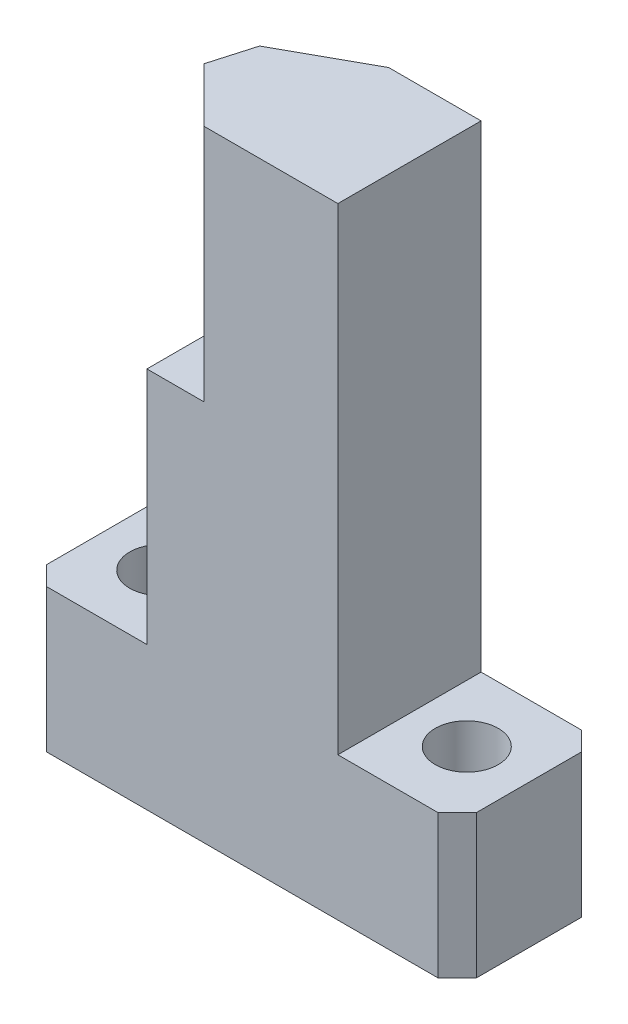
ISO-10303-21;
HEADER;
FILE_DESCRIPTION(('STEP AP214'),'2;1');
FILE_NAME('part.step','',(''),(''),'','','');
FILE_SCHEMA(('AUTOMOTIVE_DESIGN { 1 0 10303 214 1 1 1 1 }'));
ENDSEC;
DATA;
#1=APPLICATION_CONTEXT('core data for automotive mechanical design processes');
#2=APPLICATION_PROTOCOL_DEFINITION('international standard','automotive_design',2000,#1);
#3=PRODUCT_CONTEXT('',#1,'mechanical');
#4=PRODUCT('Part','Part','',(#3));
#5=PRODUCT_RELATED_PRODUCT_CATEGORY('part','',(#4));
#6=PRODUCT_DEFINITION_FORMATION('','',#4);
#7=PRODUCT_DEFINITION_CONTEXT('part definition',#1,'design');
#8=PRODUCT_DEFINITION('design','',#6,#7);
#9=PRODUCT_DEFINITION_SHAPE('','',#8);
#10=(LENGTH_UNIT() NAMED_UNIT(*) SI_UNIT(.MILLI.,.METRE.));
#11=(NAMED_UNIT(*) PLANE_ANGLE_UNIT() SI_UNIT($,.RADIAN.));
#12=(NAMED_UNIT(*) SI_UNIT($,.STERADIAN.) SOLID_ANGLE_UNIT());
#13=UNCERTAINTY_MEASURE_WITH_UNIT(LENGTH_MEASURE(1.E-05),#10,'distance_accuracy_value','');
#14=(GEOMETRIC_REPRESENTATION_CONTEXT(3) GLOBAL_UNCERTAINTY_ASSIGNED_CONTEXT((#13)) GLOBAL_UNIT_ASSIGNED_CONTEXT((#10,
#11,#12)) REPRESENTATION_CONTEXT('',''));
#15=CARTESIAN_POINT('',(0.,0.,0.));
#16=DIRECTION('',(0.,0.,1.));
#17=DIRECTION('',(1.,0.,0.));
#18=AXIS2_PLACEMENT_3D('',#15,#16,#17);
#19=CARTESIAN_POINT('',(-22.5,15.,7.5));
#20=DIRECTION('',(0.,0.,-1.));
#21=DIRECTION('',(-1.,0.,0.));
#22=AXIS2_PLACEMENT_3D('',#19,#20,#21);
#23=PLANE('',#22);
#24=DIRECTION('',(1.,0.,0.));
#25=VECTOR('',#24,1.);
#26=CARTESIAN_POINT('',(-22.5,0.,7.5));
#27=LINE('',#26,#25);
#28=CARTESIAN_POINT('',(-20.5,0.,7.5));
#29=VERTEX_POINT('',#28);
#30=CARTESIAN_POINT('',(20.5,0.,7.5));
#31=VERTEX_POINT('',#30);
#32=EDGE_CURVE('E218',#29,#31,#27,.T.);
#33=ORIENTED_EDGE('',*,*,#32,.T.);
#34=DIRECTION('',(0.,1.,0.));
#35=VECTOR('',#34,1.);
#36=CARTESIAN_POINT('',(20.5,15.,7.5));
#37=LINE('',#36,#35);
#38=CARTESIAN_POINT('',(20.5,15.,7.5));
#39=VERTEX_POINT('',#38);
#40=EDGE_CURVE('E237',#31,#39,#37,.T.);
#41=ORIENTED_EDGE('',*,*,#40,.T.);
#42=DIRECTION('',(1.,0.,0.));
#43=VECTOR('',#42,1.);
#44=CARTESIAN_POINT('',(-22.5,15.,7.5));
#45=LINE('',#44,#43);
#46=CARTESIAN_POINT('',(10.,15.,7.5));
#47=VERTEX_POINT('',#46);
#48=EDGE_CURVE('E220',#47,#39,#45,.T.);
#49=ORIENTED_EDGE('',*,*,#48,.F.);
#50=DIRECTION('',(0.,-1.,0.));
#51=VECTOR('',#50,1.);
#52=CARTESIAN_POINT('',(10.,65.,7.5));
#53=LINE('',#52,#51);
#54=CARTESIAN_POINT('',(10.,65.,7.5));
#55=VERTEX_POINT('',#54);
#56=EDGE_CURVE('E265',#55,#47,#53,.T.);
#57=ORIENTED_EDGE('',*,*,#56,.F.);
#58=DIRECTION('',(1.,0.,0.));
#59=VECTOR('',#58,1.);
#60=CARTESIAN_POINT('',(10.,65.,7.5));
#61=LINE('',#60,#59);
#62=CARTESIAN_POINT('',(-4.,65.,7.5));
#63=VERTEX_POINT('',#62);
#64=EDGE_CURVE('E169',#63,#55,#61,.T.);
#65=ORIENTED_EDGE('',*,*,#64,.F.);
#66=DIRECTION('',(0.,1.,0.));
#67=VECTOR('',#66,1.);
#68=CARTESIAN_POINT('',(-4.,40.,7.5));
#69=LINE('',#68,#67);
#70=CARTESIAN_POINT('',(-4.,40.,7.5));
#71=VERTEX_POINT('',#70);
#72=EDGE_CURVE('E140',#71,#63,#69,.T.);
#73=ORIENTED_EDGE('',*,*,#72,.F.);
#74=DIRECTION('',(1.,0.,0.));
#75=VECTOR('',#74,1.);
#76=CARTESIAN_POINT('',(0.,40.,7.5));
#77=LINE('',#76,#75);
#78=CARTESIAN_POINT('',(-10.,40.,7.5));
#79=VERTEX_POINT('',#78);
#80=EDGE_CURVE('E141',#79,#71,#77,.T.);
#81=ORIENTED_EDGE('',*,*,#80,.F.);
#82=DIRECTION('',(0.,-1.,0.));
#83=VECTOR('',#82,1.);
#84=CARTESIAN_POINT('',(-10.,65.,7.5));
#85=LINE('',#84,#83);
#86=CARTESIAN_POINT('',(-10.,15.,7.5));
#87=VERTEX_POINT('',#86);
#88=EDGE_CURVE('E190',#79,#87,#85,.T.);
#89=ORIENTED_EDGE('',*,*,#88,.T.);
#90=CARTESIAN_POINT('',(-20.5,15.,7.5));
#91=VERTEX_POINT('',#90);
#92=EDGE_CURVE('E198',#91,#87,#45,.T.);
#93=ORIENTED_EDGE('',*,*,#92,.F.);
#94=DIRECTION('',(0.,-1.,0.));
#95=VECTOR('',#94,1.);
#96=CARTESIAN_POINT('',(-20.5,15.,7.5));
#97=LINE('',#96,#95);
#98=EDGE_CURVE('E234',#91,#29,#97,.T.);
#99=ORIENTED_EDGE('',*,*,#98,.T.);
#100=EDGE_LOOP('',(#33,#41,#49,#57,#65,#73,#81,#89,#93,#99));
#101=FACE_BOUND('',#100,.T.);
#102=ADVANCED_FACE('F17',(#101),#23,.F.);
#103=CARTESIAN_POINT('',(-10.,65.,7.5));
#104=DIRECTION('',(1.,0.,0.));
#105=DIRECTION('',(0.,0.,-1.));
#106=AXIS2_PLACEMENT_3D('',#103,#104,#105);
#107=PLANE('',#106);
#108=DIRECTION('',(0.,0.,1.));
#109=VECTOR('',#108,1.);
#110=CARTESIAN_POINT('',(-10.,40.,0.));
#111=LINE('',#110,#109);
#112=CARTESIAN_POINT('',(-10.,40.,-7.5));
#113=VERTEX_POINT('',#112);
#114=EDGE_CURVE('E158',#113,#79,#111,.T.);
#115=ORIENTED_EDGE('',*,*,#114,.F.);
#116=DIRECTION('',(0.,-1.,0.));
#117=VECTOR('',#116,1.);
#118=CARTESIAN_POINT('',(-10.,65.,-7.5));
#119=LINE('',#118,#117);
#120=CARTESIAN_POINT('',(-10.,15.,-7.5));
#121=VERTEX_POINT('',#120);
#122=EDGE_CURVE('E177',#113,#121,#119,.T.);
#123=ORIENTED_EDGE('',*,*,#122,.T.);
#124=DIRECTION('',(0.,0.,1.));
#125=VECTOR('',#124,1.);
#126=CARTESIAN_POINT('',(-10.,15.,7.5));
#127=LINE('',#126,#125);
#128=EDGE_CURVE('E167',#121,#87,#127,.T.);
#129=ORIENTED_EDGE('',*,*,#128,.T.);
#130=ORIENTED_EDGE('',*,*,#88,.F.);
#131=EDGE_LOOP('',(#115,#123,#129,#130));
#132=FACE_BOUND('',#131,.T.);
#133=ADVANCED_FACE('F326',(#132),#107,.F.);
#134=CARTESIAN_POINT('',(0.,65.,0.));
#135=DIRECTION('',(0.,1.,0.));
#136=DIRECTION('',(0.,0.,1.));
#137=AXIS2_PLACEMENT_3D('',#134,#135,#136);
#138=PLANE('',#137);
#139=DIRECTION('',(-1.,0.,0.));
#140=VECTOR('',#139,1.);
#141=CARTESIAN_POINT('',(10.,65.,-7.5));
#142=LINE('',#141,#140);
#143=CARTESIAN_POINT('',(10.,65.,-7.5));
#144=VERTEX_POINT('',#143);
#145=CARTESIAN_POINT('',(0.315668910006954,65.,-7.5));
#146=VERTEX_POINT('',#145);
#147=EDGE_CURVE('E174',#144,#146,#142,.T.);
#148=ORIENTED_EDGE('',*,*,#147,.T.);
#149=DIRECTION('',(0.875464527000014,0.,-0.483282383255009));
#150=VECTOR('',#149,1.);
#151=CARTESIAN_POINT('',(-3.09949615459282,65.,-5.61472759806178));
#152=LINE('',#151,#150);
#153=CARTESIAN_POINT('',(-8.38657326651187,65.,-2.69610422921201));
#154=VERTEX_POINT('',#153);
#155=EDGE_CURVE('E197',#146,#154,#152,.F.);
#156=ORIENTED_EDGE('',*,*,#155,.T.);
#157=DIRECTION('',(0.277314653302372,0.,-0.960779154157596));
#158=VECTOR('',#157,1.);
#159=CARTESIAN_POINT('',(-8.4599621167117,65.,-2.44184259326913));
#160=LINE('',#159,#158);
#161=CARTESIAN_POINT('',(-9.68782205320584,65.,1.81217794679422));
#162=VERTEX_POINT('',#161);
#163=EDGE_CURVE('E151',#162,#154,#160,.T.);
#164=ORIENTED_EDGE('',*,*,#163,.F.);
#165=DIRECTION('',(0.707106781186552,0.,0.707106781186544));
#166=VECTOR('',#165,1.);
#167=CARTESIAN_POINT('',(-5.75,65.,5.75));
#168=LINE('',#167,#166);
#169=EDGE_CURVE('E135',#162,#63,#168,.T.);
#170=ORIENTED_EDGE('',*,*,#169,.T.);
#171=ORIENTED_EDGE('',*,*,#64,.T.);
#172=DIRECTION('',(0.,0.,-1.));
#173=VECTOR('',#172,1.);
#174=CARTESIAN_POINT('',(10.,65.,7.5));
#175=LINE('',#174,#173);
#176=EDGE_CURVE('E171',#55,#144,#175,.T.);
#177=ORIENTED_EDGE('',*,*,#176,.T.);
#178=EDGE_LOOP('',(#148,#156,#164,#170,#171,#177));
#179=FACE_BOUND('',#178,.T.);
#180=ADVANCED_FACE('F332',(#179),#138,.T.);
#181=CARTESIAN_POINT('',(0.,15.,0.));
#182=DIRECTION('',(0.,-1.,0.));
#183=DIRECTION('',(0.,0.,-1.));
#184=AXIS2_PLACEMENT_3D('',#181,#182,#183);
#185=PLANE('',#184);
#186=CARTESIAN_POINT('',(-16.,15.,0.));
#187=DIRECTION('',(0.,1.,0.));
#188=DIRECTION('',(0.,0.,1.));
#189=AXIS2_PLACEMENT_3D('',#186,#187,#188);
#190=CIRCLE('',#189,3.3);
#191=CARTESIAN_POINT('',(-16.,15.,3.3));
#192=VERTEX_POINT('',#191);
#193=EDGE_CURVE('E506',#192,#192,#190,.T.);
#194=ORIENTED_EDGE('',*,*,#193,.F.);
#195=EDGE_LOOP('',(#194));
#196=FACE_BOUND('',#195,.T.);
#197=DIRECTION('',(0.,0.,1.));
#198=VECTOR('',#197,1.);
#199=CARTESIAN_POINT('',(-22.5,15.,7.5));
#200=LINE('',#199,#198);
#201=CARTESIAN_POINT('',(-22.5,15.,-5.5));
#202=VERTEX_POINT('',#201);
#203=CARTESIAN_POINT('',(-22.5,15.,5.5));
#204=VERTEX_POINT('',#203);
#205=EDGE_CURVE('E207',#202,#204,#200,.T.);
#206=ORIENTED_EDGE('',*,*,#205,.T.);
#207=DIRECTION('',(-0.707106781186547,0.,-0.707106781186549));
#208=VECTOR('',#207,1.);
#209=CARTESIAN_POINT('',(-20.5,15.,7.5));
#210=LINE('',#209,#208);
#211=EDGE_CURVE('E11',#204,#91,#210,.F.);
#212=ORIENTED_EDGE('',*,*,#211,.T.);
#213=ORIENTED_EDGE('',*,*,#92,.T.);
#214=ORIENTED_EDGE('',*,*,#128,.F.);
#215=DIRECTION('',(-1.,0.,0.));
#216=VECTOR('',#215,1.);
#217=CARTESIAN_POINT('',(-22.5,15.,-7.5));
#218=LINE('',#217,#216);
#219=CARTESIAN_POINT('',(-20.5,15.,-7.5));
#220=VERTEX_POINT('',#219);
#221=EDGE_CURVE('E208',#121,#220,#218,.T.);
#222=ORIENTED_EDGE('',*,*,#221,.T.);
#223=DIRECTION('',(0.70710678118655,0.,-0.707106781186545));
#224=VECTOR('',#223,1.);
#225=CARTESIAN_POINT('',(-22.5,15.,-5.5));
#226=LINE('',#225,#224);
#227=EDGE_CURVE('E25',#220,#202,#226,.F.);
#228=ORIENTED_EDGE('',*,*,#227,.T.);
#229=EDGE_LOOP('',(#206,#212,#213,#214,#222,#228));
#230=FACE_BOUND('',#229,.T.);
#231=ADVANCED_FACE('F311',(#196,#230),#185,.F.);
#232=CARTESIAN_POINT('',(16.,15.,0.));
#233=DIRECTION('',(0.,1.,0.));
#234=DIRECTION('',(0.,0.,1.));
#235=AXIS2_PLACEMENT_3D('',#232,#233,#234);
#236=CIRCLE('',#235,3.3);
#237=CARTESIAN_POINT('',(16.,15.,3.3));
#238=VERTEX_POINT('',#237);
#239=EDGE_CURVE('E501',#238,#238,#236,.T.);
#240=ORIENTED_EDGE('',*,*,#239,.F.);
#241=EDGE_LOOP('',(#240));
#242=FACE_BOUND('',#241,.T.);
#243=DIRECTION('',(0.,0.,-1.));
#244=VECTOR('',#243,1.);
#245=CARTESIAN_POINT('',(22.5,15.,7.5));
#246=LINE('',#245,#244);
#247=CARTESIAN_POINT('',(22.5,15.,5.5));
#248=VERTEX_POINT('',#247);
#249=CARTESIAN_POINT('',(22.5,15.,-5.5));
#250=VERTEX_POINT('',#249);
#251=EDGE_CURVE('E212',#248,#250,#246,.T.);
#252=ORIENTED_EDGE('',*,*,#251,.T.);
#253=DIRECTION('',(0.707106781186546,0.,0.707106781186549));
#254=VECTOR('',#253,1.);
#255=CARTESIAN_POINT('',(20.5,15.,-7.5));
#256=LINE('',#255,#254);
#257=CARTESIAN_POINT('',(20.5,15.,-7.5));
#258=VERTEX_POINT('',#257);
#259=EDGE_CURVE('E232',#250,#258,#256,.F.);
#260=ORIENTED_EDGE('',*,*,#259,.T.);
#261=CARTESIAN_POINT('',(10.,15.,-7.5));
#262=VERTEX_POINT('',#261);
#263=EDGE_CURVE('E204',#258,#262,#218,.T.);
#264=ORIENTED_EDGE('',*,*,#263,.T.);
#265=DIRECTION('',(0.,0.,-1.));
#266=VECTOR('',#265,1.);
#267=CARTESIAN_POINT('',(10.,15.,7.5));
#268=LINE('',#267,#266);
#269=EDGE_CURVE('E172',#47,#262,#268,.T.);
#270=ORIENTED_EDGE('',*,*,#269,.F.);
#271=ORIENTED_EDGE('',*,*,#48,.T.);
#272=DIRECTION('',(-0.70710678118655,0.,0.707106781186545));
#273=VECTOR('',#272,1.);
#274=CARTESIAN_POINT('',(22.5,15.,5.5));
#275=LINE('',#274,#273);
#276=EDGE_CURVE('E296',#39,#248,#275,.F.);
#277=ORIENTED_EDGE('',*,*,#276,.T.);
#278=EDGE_LOOP('',(#252,#260,#264,#270,#271,#277));
#279=FACE_BOUND('',#278,.T.);
#280=ADVANCED_FACE('F288',(#242,#279),#185,.F.);
#281=CARTESIAN_POINT('',(22.5,15.,7.5));
#282=DIRECTION('',(-1.,0.,0.));
#283=DIRECTION('',(0.,0.,1.));
#284=AXIS2_PLACEMENT_3D('',#281,#282,#283);
#285=PLANE('',#284);
#286=DIRECTION('',(0.,0.,-1.));
#287=VECTOR('',#286,1.);
#288=CARTESIAN_POINT('',(22.5,0.,7.5));
#289=LINE('',#288,#287);
#290=CARTESIAN_POINT('',(22.5,0.,5.5));
#291=VERTEX_POINT('',#290);
#292=CARTESIAN_POINT('',(22.5,0.,-5.5));
#293=VERTEX_POINT('',#292);
#294=EDGE_CURVE('E226',#291,#293,#289,.T.);
#295=ORIENTED_EDGE('',*,*,#294,.T.);
#296=DIRECTION('',(0.,1.,0.));
#297=VECTOR('',#296,1.);
#298=CARTESIAN_POINT('',(22.5,15.,-5.5));
#299=LINE('',#298,#297);
#300=EDGE_CURVE('E299',#293,#250,#299,.T.);
#301=ORIENTED_EDGE('',*,*,#300,.T.);
#302=ORIENTED_EDGE('',*,*,#251,.F.);
#303=DIRECTION('',(0.,-1.,0.));
#304=VECTOR('',#303,1.);
#305=CARTESIAN_POINT('',(22.5,15.,5.5));
#306=LINE('',#305,#304);
#307=EDGE_CURVE('E297',#248,#291,#306,.T.);
#308=ORIENTED_EDGE('',*,*,#307,.T.);
#309=EDGE_LOOP('',(#295,#301,#302,#308));
#310=FACE_BOUND('',#309,.T.);
#311=ADVANCED_FACE('F342',(#310),#285,.F.);
#312=CARTESIAN_POINT('',(-22.5,15.,-7.5));
#313=DIRECTION('',(0.,0.,1.));
#314=DIRECTION('',(1.,0.,0.));
#315=AXIS2_PLACEMENT_3D('',#312,#313,#314);
#316=PLANE('',#315);
#317=ORIENTED_EDGE('',*,*,#263,.F.);
#318=DIRECTION('',(0.,-1.,0.));
#319=VECTOR('',#318,1.);
#320=CARTESIAN_POINT('',(20.5,15.,-7.5));
#321=LINE('',#320,#319);
#322=CARTESIAN_POINT('',(20.5,0.,-7.5));
#323=VERTEX_POINT('',#322);
#324=EDGE_CURVE('E307',#258,#323,#321,.T.);
#325=ORIENTED_EDGE('',*,*,#324,.T.);
#326=DIRECTION('',(-1.,0.,0.));
#327=VECTOR('',#326,1.);
#328=CARTESIAN_POINT('',(-22.5,0.,-7.5));
#329=LINE('',#328,#327);
#330=CARTESIAN_POINT('',(-20.5,0.,-7.5));
#331=VERTEX_POINT('',#330);
#332=EDGE_CURVE('E254',#323,#331,#329,.T.);
#333=ORIENTED_EDGE('',*,*,#332,.T.);
#334=DIRECTION('',(0.,1.,0.));
#335=VECTOR('',#334,1.);
#336=CARTESIAN_POINT('',(-20.5,15.,-7.5));
#337=LINE('',#336,#335);
#338=EDGE_CURVE('E203',#331,#220,#337,.T.);
#339=ORIENTED_EDGE('',*,*,#338,.T.);
#340=ORIENTED_EDGE('',*,*,#221,.F.);
#341=ORIENTED_EDGE('',*,*,#122,.F.);
#342=DIRECTION('',(-1.,0.,0.));
#343=VECTOR('',#342,1.);
#344=CARTESIAN_POINT('',(0.,40.,-7.5));
#345=LINE('',#344,#343);
#346=CARTESIAN_POINT('',(0.315668910006961,40.,-7.5));
#347=VERTEX_POINT('',#346);
#348=EDGE_CURVE('E156',#347,#113,#345,.T.);
#349=ORIENTED_EDGE('',*,*,#348,.F.);
#350=DIRECTION('',(0.,1.,0.));
#351=VECTOR('',#350,1.);
#352=CARTESIAN_POINT('',(0.315668910006961,15.,-7.5));
#353=LINE('',#352,#351);
#354=EDGE_CURVE('E194',#347,#146,#353,.T.);
#355=ORIENTED_EDGE('',*,*,#354,.T.);
#356=ORIENTED_EDGE('',*,*,#147,.F.);
#357=DIRECTION('',(0.,-1.,0.));
#358=VECTOR('',#357,1.);
#359=CARTESIAN_POINT('',(10.,65.,-7.5));
#360=LINE('',#359,#358);
#361=EDGE_CURVE('E193',#144,#262,#360,.T.);
#362=ORIENTED_EDGE('',*,*,#361,.T.);
#363=EDGE_LOOP('',(#317,#325,#333,#339,#340,#341,#349,#355,#356,#362));
#364=FACE_BOUND('',#363,.T.);
#365=ADVANCED_FACE('F282',(#364),#316,.F.);
#366=CARTESIAN_POINT('',(-22.5,15.,7.5));
#367=DIRECTION('',(1.,0.,0.));
#368=DIRECTION('',(0.,0.,-1.));
#369=AXIS2_PLACEMENT_3D('',#366,#367,#368);
#370=PLANE('',#369);
#371=DIRECTION('',(0.,0.,1.));
#372=VECTOR('',#371,1.);
#373=CARTESIAN_POINT('',(-22.5,0.,7.5));
#374=LINE('',#373,#372);
#375=CARTESIAN_POINT('',(-22.5,0.,-5.5));
#376=VERTEX_POINT('',#375);
#377=CARTESIAN_POINT('',(-22.5,0.,5.5));
#378=VERTEX_POINT('',#377);
#379=EDGE_CURVE('E245',#376,#378,#374,.T.);
#380=ORIENTED_EDGE('',*,*,#379,.T.);
#381=DIRECTION('',(0.,1.,0.));
#382=VECTOR('',#381,1.);
#383=CARTESIAN_POINT('',(-22.5,15.,5.5));
#384=LINE('',#383,#382);
#385=EDGE_CURVE('E32',#378,#204,#384,.T.);
#386=ORIENTED_EDGE('',*,*,#385,.T.);
#387=ORIENTED_EDGE('',*,*,#205,.F.);
#388=DIRECTION('',(0.,-1.,0.));
#389=VECTOR('',#388,1.);
#390=CARTESIAN_POINT('',(-22.5,15.,-5.5));
#391=LINE('',#390,#389);
#392=EDGE_CURVE('E239',#202,#376,#391,.T.);
#393=ORIENTED_EDGE('',*,*,#392,.T.);
#394=EDGE_LOOP('',(#380,#386,#387,#393));
#395=FACE_BOUND('',#394,.T.);
#396=ADVANCED_FACE('F244',(#395),#370,.F.);
#397=CARTESIAN_POINT('',(0.,0.,0.));
#398=DIRECTION('',(0.,-1.,0.));
#399=DIRECTION('',(0.,0.,-1.));
#400=AXIS2_PLACEMENT_3D('',#397,#398,#399);
#401=PLANE('',#400);
#402=CARTESIAN_POINT('',(-16.,0.,0.));
#403=DIRECTION('',(0.,1.,0.));
#404=DIRECTION('',(0.,0.,1.));
#405=AXIS2_PLACEMENT_3D('',#402,#403,#404);
#406=CIRCLE('',#405,3.3);
#407=CARTESIAN_POINT('',(-16.,0.,3.3));
#408=VERTEX_POINT('',#407);
#409=EDGE_CURVE('E498',#408,#408,#406,.T.);
#410=ORIENTED_EDGE('',*,*,#409,.T.);
#411=EDGE_LOOP('',(#410));
#412=FACE_BOUND('',#411,.T.);
#413=CARTESIAN_POINT('',(16.,0.,0.));
#414=DIRECTION('',(0.,1.,0.));
#415=DIRECTION('',(0.,0.,1.));
#416=AXIS2_PLACEMENT_3D('',#413,#414,#415);
#417=CIRCLE('',#416,3.3);
#418=CARTESIAN_POINT('',(16.,0.,3.3));
#419=VERTEX_POINT('',#418);
#420=EDGE_CURVE('E165',#419,#419,#417,.T.);
#421=ORIENTED_EDGE('',*,*,#420,.T.);
#422=EDGE_LOOP('',(#421));
#423=FACE_BOUND('',#422,.T.);
#424=ORIENTED_EDGE('',*,*,#332,.F.);
#425=DIRECTION('',(-0.707106781186546,0.,-0.707106781186549));
#426=VECTOR('',#425,1.);
#427=CARTESIAN_POINT('',(14.,0.,-14.));
#428=LINE('',#427,#426);
#429=EDGE_CURVE('E303',#323,#293,#428,.F.);
#430=ORIENTED_EDGE('',*,*,#429,.T.);
#431=ORIENTED_EDGE('',*,*,#294,.F.);
#432=DIRECTION('',(0.70710678118655,0.,-0.707106781186545));
#433=VECTOR('',#432,1.);
#434=CARTESIAN_POINT('',(14.,0.,14.));
#435=LINE('',#434,#433);
#436=EDGE_CURVE('E295',#291,#31,#435,.F.);
#437=ORIENTED_EDGE('',*,*,#436,.T.);
#438=ORIENTED_EDGE('',*,*,#32,.F.);
#439=DIRECTION('',(0.707106781186547,0.,0.707106781186549));
#440=VECTOR('',#439,1.);
#441=CARTESIAN_POINT('',(-14.,0.,14.));
#442=LINE('',#441,#440);
#443=EDGE_CURVE('E253',#29,#378,#442,.F.);
#444=ORIENTED_EDGE('',*,*,#443,.T.);
#445=ORIENTED_EDGE('',*,*,#379,.F.);
#446=DIRECTION('',(-0.70710678118655,0.,0.707106781186545));
#447=VECTOR('',#446,1.);
#448=CARTESIAN_POINT('',(-14.,0.,-14.));
#449=LINE('',#448,#447);
#450=EDGE_CURVE('E250',#376,#331,#449,.F.);
#451=ORIENTED_EDGE('',*,*,#450,.T.);
#452=EDGE_LOOP('',(#424,#430,#431,#437,#438,#444,#445,#451));
#453=FACE_BOUND('',#452,.T.);
#454=ADVANCED_FACE('F249',(#412,#423,#453),#401,.T.);
#455=CARTESIAN_POINT('',(10.,65.,7.5));
#456=DIRECTION('',(-1.,0.,0.));
#457=DIRECTION('',(0.,0.,1.));
#458=AXIS2_PLACEMENT_3D('',#455,#456,#457);
#459=PLANE('',#458);
#460=ORIENTED_EDGE('',*,*,#269,.T.);
#461=ORIENTED_EDGE('',*,*,#361,.F.);
#462=ORIENTED_EDGE('',*,*,#176,.F.);
#463=ORIENTED_EDGE('',*,*,#56,.T.);
#464=EDGE_LOOP('',(#460,#461,#462,#463));
#465=FACE_BOUND('',#464,.T.);
#466=ADVANCED_FACE('F284',(#465),#459,.F.);
#467=CARTESIAN_POINT('',(-5.75,40.,5.75));
#468=DIRECTION('',(-0.707106781186544,0.,0.707106781186552));
#469=DIRECTION('',(0.707106781186552,0.,0.707106781186544));
#470=AXIS2_PLACEMENT_3D('',#467,#468,#469);
#471=PLANE('',#470);
#472=ORIENTED_EDGE('',*,*,#169,.F.);
#473=DIRECTION('',(0.,1.,0.));
#474=VECTOR('',#473,1.);
#475=CARTESIAN_POINT('',(-9.68782205320584,40.,1.81217794679422));
#476=LINE('',#475,#474);
#477=CARTESIAN_POINT('',(-9.68782205320584,40.,1.81217794679422));
#478=VERTEX_POINT('',#477);
#479=EDGE_CURVE('E129',#478,#162,#476,.T.);
#480=ORIENTED_EDGE('',*,*,#479,.F.);
#481=DIRECTION('',(0.707106781186552,0.,0.707106781186544));
#482=VECTOR('',#481,1.);
#483=CARTESIAN_POINT('',(-5.75,40.,5.75));
#484=LINE('',#483,#482);
#485=EDGE_CURVE('E132',#478,#71,#484,.T.);
#486=ORIENTED_EDGE('',*,*,#485,.T.);
#487=ORIENTED_EDGE('',*,*,#72,.T.);
#488=EDGE_LOOP('',(#472,#480,#486,#487));
#489=FACE_BOUND('',#488,.T.);
#490=ADVANCED_FACE('F131',(#489),#471,.T.);
#491=CARTESIAN_POINT('',(-8.4599621167117,40.,-2.44184259326913));
#492=DIRECTION('',(0.960779154157596,0.,0.277314653302372));
#493=DIRECTION('',(0.277314653302372,0.,-0.960779154157596));
#494=AXIS2_PLACEMENT_3D('',#491,#492,#493);
#495=PLANE('',#494);
#496=ORIENTED_EDGE('',*,*,#163,.T.);
#497=DIRECTION('',(0.,-1.,0.));
#498=VECTOR('',#497,1.);
#499=CARTESIAN_POINT('',(-8.38657326651187,40.,-2.69610422921201));
#500=LINE('',#499,#498);
#501=CARTESIAN_POINT('',(-8.38657326651187,40.,-2.69610422921201));
#502=VERTEX_POINT('',#501);
#503=EDGE_CURVE('E155',#154,#502,#500,.T.);
#504=ORIENTED_EDGE('',*,*,#503,.T.);
#505=DIRECTION('',(0.277314653302372,0.,-0.960779154157596));
#506=VECTOR('',#505,1.);
#507=CARTESIAN_POINT('',(-8.4599621167117,40.,-2.44184259326913));
#508=LINE('',#507,#506);
#509=EDGE_CURVE('E147',#478,#502,#508,.T.);
#510=ORIENTED_EDGE('',*,*,#509,.F.);
#511=ORIENTED_EDGE('',*,*,#479,.T.);
#512=EDGE_LOOP('',(#496,#504,#510,#511));
#513=FACE_BOUND('',#512,.T.);
#514=ADVANCED_FACE('F153',(#513),#495,.F.);
#515=CARTESIAN_POINT('',(0.,40.,0.));
#516=DIRECTION('',(0.,1.,0.));
#517=DIRECTION('',(0.,0.,1.));
#518=AXIS2_PLACEMENT_3D('',#515,#516,#517);
#519=PLANE('',#518);
#520=ORIENTED_EDGE('',*,*,#485,.F.);
#521=ORIENTED_EDGE('',*,*,#509,.T.);
#522=DIRECTION('',(-0.875464527000014,0.,0.483282383255009));
#523=VECTOR('',#522,1.);
#524=CARTESIAN_POINT('',(0.315668910006961,40.,-7.5));
#525=LINE('',#524,#523);
#526=EDGE_CURVE('E201',#502,#347,#525,.F.);
#527=ORIENTED_EDGE('',*,*,#526,.T.);
#528=ORIENTED_EDGE('',*,*,#348,.T.);
#529=ORIENTED_EDGE('',*,*,#114,.T.);
#530=ORIENTED_EDGE('',*,*,#80,.T.);
#531=EDGE_LOOP('',(#520,#521,#527,#528,#529,#530));
#532=FACE_BOUND('',#531,.T.);
#533=ADVANCED_FACE('F145',(#532),#519,.T.);
#534=CARTESIAN_POINT('',(0.315668910006961,15.,-7.5));
#535=DIRECTION('',(0.483282383255009,0.,0.875464527000014));
#536=DIRECTION('',(0.,1.,0.));
#537=AXIS2_PLACEMENT_3D('',#534,#535,#536);
#538=PLANE('',#537);
#539=ORIENTED_EDGE('',*,*,#526,.F.);
#540=ORIENTED_EDGE('',*,*,#503,.F.);
#541=ORIENTED_EDGE('',*,*,#155,.F.);
#542=ORIENTED_EDGE('',*,*,#354,.F.);
#543=EDGE_LOOP('',(#539,#540,#541,#542));
#544=FACE_BOUND('',#543,.T.);
#545=ADVANCED_FACE('F345',(#544),#538,.F.);
#546=CARTESIAN_POINT('',(20.5,15.,-7.5));
#547=DIRECTION('',(-0.707106781186549,0.,0.707106781186546));
#548=DIRECTION('',(0.,-1.,0.));
#549=AXIS2_PLACEMENT_3D('',#546,#547,#548);
#550=PLANE('',#549);
#551=ORIENTED_EDGE('',*,*,#259,.F.);
#552=ORIENTED_EDGE('',*,*,#300,.F.);
#553=ORIENTED_EDGE('',*,*,#429,.F.);
#554=ORIENTED_EDGE('',*,*,#324,.F.);
#555=EDGE_LOOP('',(#551,#552,#553,#554));
#556=FACE_BOUND('',#555,.T.);
#557=ADVANCED_FACE('F348',(#556),#550,.F.);
#558=CARTESIAN_POINT('',(22.5,15.,5.5));
#559=DIRECTION('',(-0.707106781186545,0.,-0.70710678118655));
#560=DIRECTION('',(0.,-1.,0.));
#561=AXIS2_PLACEMENT_3D('',#558,#559,#560);
#562=PLANE('',#561);
#563=ORIENTED_EDGE('',*,*,#276,.F.);
#564=ORIENTED_EDGE('',*,*,#40,.F.);
#565=ORIENTED_EDGE('',*,*,#436,.F.);
#566=ORIENTED_EDGE('',*,*,#307,.F.);
#567=EDGE_LOOP('',(#563,#564,#565,#566));
#568=FACE_BOUND('',#567,.T.);
#569=ADVANCED_FACE('F293',(#568),#562,.F.);
#570=CARTESIAN_POINT('',(-20.5,15.,7.5));
#571=DIRECTION('',(0.707106781186549,0.,-0.707106781186547));
#572=DIRECTION('',(0.,-1.,0.));
#573=AXIS2_PLACEMENT_3D('',#570,#571,#572);
#574=PLANE('',#573);
#575=ORIENTED_EDGE('',*,*,#211,.F.);
#576=ORIENTED_EDGE('',*,*,#385,.F.);
#577=ORIENTED_EDGE('',*,*,#443,.F.);
#578=ORIENTED_EDGE('',*,*,#98,.F.);
#579=EDGE_LOOP('',(#575,#576,#577,#578));
#580=FACE_BOUND('',#579,.T.);
#581=ADVANCED_FACE('F314',(#580),#574,.F.);
#582=CARTESIAN_POINT('',(-22.5,15.,-5.5));
#583=DIRECTION('',(0.707106781186545,0.,0.70710678118655));
#584=DIRECTION('',(0.,-1.,0.));
#585=AXIS2_PLACEMENT_3D('',#582,#583,#584);
#586=PLANE('',#585);
#587=ORIENTED_EDGE('',*,*,#227,.F.);
#588=ORIENTED_EDGE('',*,*,#338,.F.);
#589=ORIENTED_EDGE('',*,*,#450,.F.);
#590=ORIENTED_EDGE('',*,*,#392,.F.);
#591=EDGE_LOOP('',(#587,#588,#589,#590));
#592=FACE_BOUND('',#591,.T.);
#593=ADVANCED_FACE('F19',(#592),#586,.F.);
#594=CARTESIAN_POINT('',(16.,15.,0.));
#595=DIRECTION('',(0.,1.,0.));
#596=DIRECTION('',(0.,0.,1.));
#597=AXIS2_PLACEMENT_3D('',#594,#595,#596);
#598=CYLINDRICAL_SURFACE('',#597,3.3);
#599=ORIENTED_EDGE('',*,*,#420,.F.);
#600=EDGE_LOOP('',(#599));
#601=FACE_BOUND('',#600,.T.);
#602=ORIENTED_EDGE('',*,*,#239,.T.);
#603=EDGE_LOOP('',(#602));
#604=FACE_BOUND('',#603,.T.);
#605=ADVANCED_FACE('F313',(#601,#604),#598,.F.);
#606=CARTESIAN_POINT('',(-16.,15.,0.));
#607=DIRECTION('',(0.,1.,0.));
#608=DIRECTION('',(0.,0.,1.));
#609=AXIS2_PLACEMENT_3D('',#606,#607,#608);
#610=CYLINDRICAL_SURFACE('',#609,3.3);
#611=ORIENTED_EDGE('',*,*,#409,.F.);
#612=EDGE_LOOP('',(#611));
#613=FACE_BOUND('',#612,.T.);
#614=ORIENTED_EDGE('',*,*,#193,.T.);
#615=EDGE_LOOP('',(#614));
#616=FACE_BOUND('',#615,.T.);
#617=ADVANCED_FACE('F321',(#613,#616),#610,.F.);
#618=CLOSED_SHELL('',(#102,#133,#180,#231,#280,#311,#365,#396,#454,#466,#490,#514,#533,#545,
#557,#569,#581,#593,#605,#617));
#619=MANIFOLD_SOLID_BREP('B1',#618);
#620=ADVANCED_BREP_SHAPE_REPRESENTATION('',(#18,#619),#14);
#621=SHAPE_DEFINITION_REPRESENTATION(#9,#620);
ENDSEC;
END-ISO-10303-21;
